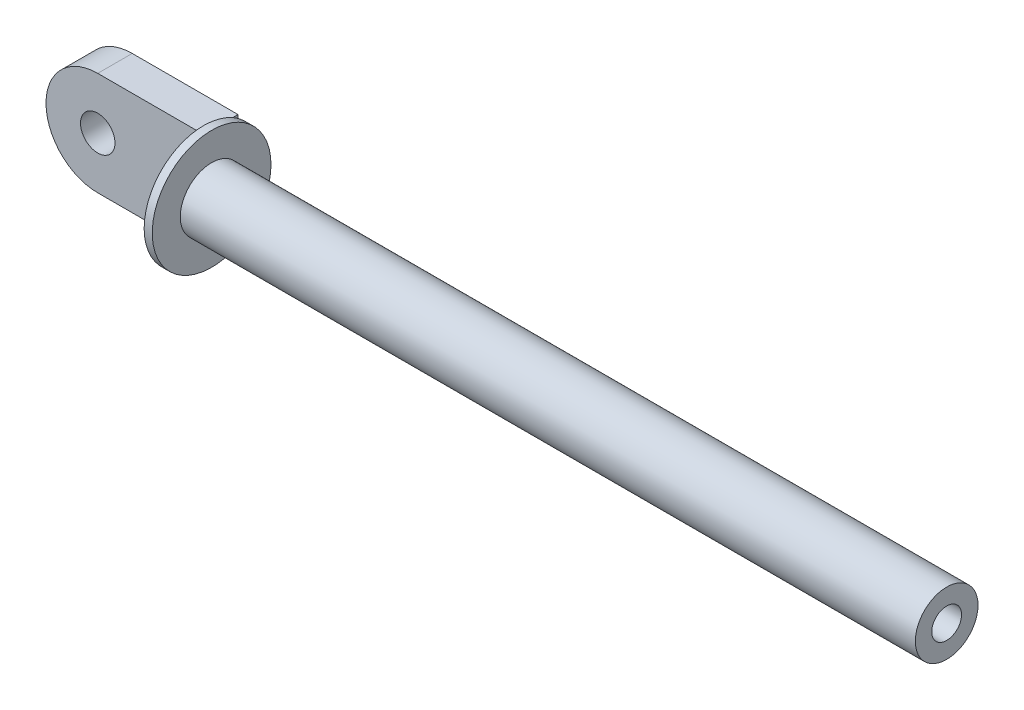
ISO-10303-21;
HEADER;
FILE_DESCRIPTION(('STEP AP214'),'2;1');
FILE_NAME('part.step','',(''),(''),'','','');
FILE_SCHEMA(('AUTOMOTIVE_DESIGN { 1 0 10303 214 1 1 1 1 }'));
ENDSEC;
DATA;
#1=APPLICATION_CONTEXT('core data for automotive mechanical design processes');
#2=APPLICATION_PROTOCOL_DEFINITION('international standard','automotive_design',2000,#1);
#3=PRODUCT_CONTEXT('',#1,'mechanical');
#4=PRODUCT('Part','Part','',(#3));
#5=PRODUCT_RELATED_PRODUCT_CATEGORY('part','',(#4));
#6=PRODUCT_DEFINITION_FORMATION('','',#4);
#7=PRODUCT_DEFINITION_CONTEXT('part definition',#1,'design');
#8=PRODUCT_DEFINITION('design','',#6,#7);
#9=PRODUCT_DEFINITION_SHAPE('','',#8);
#10=(LENGTH_UNIT() NAMED_UNIT(*) SI_UNIT(.MILLI.,.METRE.));
#11=(NAMED_UNIT(*) PLANE_ANGLE_UNIT() SI_UNIT($,.RADIAN.));
#12=(NAMED_UNIT(*) SI_UNIT($,.STERADIAN.) SOLID_ANGLE_UNIT());
#13=UNCERTAINTY_MEASURE_WITH_UNIT(LENGTH_MEASURE(1.E-05),#10,'distance_accuracy_value','');
#14=(GEOMETRIC_REPRESENTATION_CONTEXT(3) GLOBAL_UNCERTAINTY_ASSIGNED_CONTEXT((#13)) GLOBAL_UNIT_ASSIGNED_CONTEXT((#10,
#11,#12)) REPRESENTATION_CONTEXT('',''));
#15=CARTESIAN_POINT('',(0.,0.,0.));
#16=DIRECTION('',(0.,0.,1.));
#17=DIRECTION('',(1.,0.,0.));
#18=AXIS2_PLACEMENT_3D('',#15,#16,#17);
#19=CARTESIAN_POINT('',(-53.0741906660765,45.7845146012682,5.));
#20=DIRECTION('',(-1.,0.,0.));
#21=DIRECTION('',(0.,-1.,0.));
#22=AXIS2_PLACEMENT_3D('',#19,#20,#21);
#23=PLANE('',#22);
#24=CARTESIAN_POINT('',(-53.0741906660765,30.7845146012682,5.));
#25=DIRECTION('',(1.,0.,0.));
#26=DIRECTION('',(0.,0.,-1.));
#27=AXIS2_PLACEMENT_3D('',#24,#25,#26);
#28=CIRCLE('',#27,17.213274528243);
#29=CARTESIAN_POINT('',(-53.0741906660765,44.7951113046445,-5.));
#30=VERTEX_POINT('',#29);
#31=CARTESIAN_POINT('',(-53.0741906660765,45.7845146012682,-3.44374442914163));
#32=VERTEX_POINT('',#31);
#33=EDGE_CURVE('E43',#30,#32,#28,.T.);
#34=ORIENTED_EDGE('',*,*,#33,.F.);
#35=DIRECTION('',(0.,1.,0.));
#36=VECTOR('',#35,1.);
#37=CARTESIAN_POINT('',(-53.0741906660765,45.7845146012682,-5.));
#38=LINE('',#37,#36);
#39=CARTESIAN_POINT('',(-53.0741906660765,45.7845146012682,-5.));
#40=VERTEX_POINT('',#39);
#41=EDGE_CURVE('E94',#30,#40,#38,.T.);
#42=ORIENTED_EDGE('',*,*,#41,.T.);
#43=DIRECTION('',(0.,0.,-1.));
#44=VECTOR('',#43,1.);
#45=CARTESIAN_POINT('',(-53.0741906660765,45.7845146012682,5.));
#46=LINE('',#45,#44);
#47=EDGE_CURVE('E57',#32,#40,#46,.T.);
#48=ORIENTED_EDGE('',*,*,#47,.F.);
#49=EDGE_LOOP('',(#34,#42,#48));
#50=FACE_BOUND('',#49,.T.);
#51=ADVANCED_FACE('F33',(#50),#23,.F.);
#52=CARTESIAN_POINT('',(-83.7380103607654,30.7845146012682,5.));
#53=DIRECTION('',(0.,0.,1.));
#54=DIRECTION('',(1.,0.,0.));
#55=AXIS2_PLACEMENT_3D('',#52,#53,#54);
#56=PLANE('',#55);
#57=CARTESIAN_POINT('',(-83.7380103607654,30.7845146012682,5.));
#58=DIRECTION('',(0.,0.,1.));
#59=DIRECTION('',(1.,0.,0.));
#60=AXIS2_PLACEMENT_3D('',#57,#58,#59);
#61=CIRCLE('',#60,15.);
#62=CARTESIAN_POINT('',(-83.7380103607654,45.7845146012682,5.));
#63=VERTEX_POINT('',#62);
#64=CARTESIAN_POINT('',(-83.7380103607654,15.7845146012682,5.));
#65=VERTEX_POINT('',#64);
#66=EDGE_CURVE('E126',#63,#65,#61,.T.);
#67=ORIENTED_EDGE('',*,*,#66,.T.);
#68=DIRECTION('',(1.,0.,0.));
#69=VECTOR('',#68,1.);
#70=CARTESIAN_POINT('',(-83.7380103607654,15.7845146012682,5.));
#71=LINE('',#70,#69);
#72=CARTESIAN_POINT('',(-53.0741906660765,15.7845146012682,5.));
#73=VERTEX_POINT('',#72);
#74=EDGE_CURVE('E129',#65,#73,#71,.T.);
#75=ORIENTED_EDGE('',*,*,#74,.T.);
#76=DIRECTION('',(0.,1.,0.));
#77=VECTOR('',#76,1.);
#78=CARTESIAN_POINT('',(-53.0741906660765,45.7845146012682,5.));
#79=LINE('',#78,#77);
#80=CARTESIAN_POINT('',(-53.0741906660765,45.7845146012682,5.));
#81=VERTEX_POINT('',#80);
#82=EDGE_CURVE('E131',#73,#81,#79,.T.);
#83=ORIENTED_EDGE('',*,*,#82,.T.);
#84=DIRECTION('',(-1.,0.,0.));
#85=VECTOR('',#84,1.);
#86=CARTESIAN_POINT('',(-83.7380103607654,45.7845146012682,5.));
#87=LINE('',#86,#85);
#88=EDGE_CURVE('E133',#81,#63,#87,.T.);
#89=ORIENTED_EDGE('',*,*,#88,.T.);
#90=EDGE_LOOP('',(#67,#75,#83,#89));
#91=FACE_BOUND('',#90,.T.);
#92=CARTESIAN_POINT('',(-83.7380103607654,30.7845146012682,5.));
#93=DIRECTION('',(0.,0.,1.));
#94=DIRECTION('',(1.,0.,0.));
#95=AXIS2_PLACEMENT_3D('',#92,#93,#94);
#96=CIRCLE('',#95,5.00000000000001);
#97=CARTESIAN_POINT('',(-78.7380103607654,30.7845146012682,5.));
#98=VERTEX_POINT('',#97);
#99=EDGE_CURVE('E120',#98,#98,#96,.T.);
#100=ORIENTED_EDGE('',*,*,#99,.F.);
#101=EDGE_LOOP('',(#100));
#102=FACE_BOUND('',#101,.T.);
#103=ADVANCED_FACE('F158',(#91,#102),#56,.T.);
#104=CARTESIAN_POINT('',(-83.7380103607654,30.7845146012682,-5.));
#105=DIRECTION('',(0.,0.,1.));
#106=DIRECTION('',(1.,0.,0.));
#107=AXIS2_PLACEMENT_3D('',#104,#105,#106);
#108=PLANE('',#107);
#109=CARTESIAN_POINT('',(-83.7380103607654,30.7845146012682,-5.));
#110=DIRECTION('',(0.,0.,1.));
#111=DIRECTION('',(1.,0.,0.));
#112=AXIS2_PLACEMENT_3D('',#109,#110,#111);
#113=CIRCLE('',#112,15.);
#114=CARTESIAN_POINT('',(-83.7380103607654,45.7845146012682,-5.));
#115=VERTEX_POINT('',#114);
#116=CARTESIAN_POINT('',(-83.7380103607654,15.7845146012682,-5.));
#117=VERTEX_POINT('',#116);
#118=EDGE_CURVE('E123',#115,#117,#113,.T.);
#119=ORIENTED_EDGE('',*,*,#118,.F.);
#120=DIRECTION('',(-1.,0.,0.));
#121=VECTOR('',#120,1.);
#122=CARTESIAN_POINT('',(-83.7380103607654,45.7845146012682,-5.));
#123=LINE('',#122,#121);
#124=EDGE_CURVE('E91',#40,#115,#123,.T.);
#125=ORIENTED_EDGE('',*,*,#124,.F.);
#126=ORIENTED_EDGE('',*,*,#41,.F.);
#127=CARTESIAN_POINT('',(-53.0741906660765,16.7739178978918,-5.));
#128=VERTEX_POINT('',#127);
#129=EDGE_CURVE('E92',#128,#30,#38,.T.);
#130=ORIENTED_EDGE('',*,*,#129,.F.);
#131=CARTESIAN_POINT('',(-53.0741906660765,15.7845146012682,-5.));
#132=VERTEX_POINT('',#131);
#133=EDGE_CURVE('E85',#132,#128,#38,.T.);
#134=ORIENTED_EDGE('',*,*,#133,.F.);
#135=DIRECTION('',(1.,0.,0.));
#136=VECTOR('',#135,1.);
#137=CARTESIAN_POINT('',(-83.7380103607654,15.7845146012682,-5.));
#138=LINE('',#137,#136);
#139=EDGE_CURVE('E138',#117,#132,#138,.T.);
#140=ORIENTED_EDGE('',*,*,#139,.F.);
#141=EDGE_LOOP('',(#119,#125,#126,#130,#134,#140));
#142=FACE_BOUND('',#141,.T.);
#143=CARTESIAN_POINT('',(-83.7380103607654,30.7845146012682,-5.));
#144=DIRECTION('',(0.,0.,1.));
#145=DIRECTION('',(1.,0.,0.));
#146=AXIS2_PLACEMENT_3D('',#143,#144,#145);
#147=CIRCLE('',#146,5.00000000000001);
#148=CARTESIAN_POINT('',(-78.7380103607654,30.7845146012682,-5.));
#149=VERTEX_POINT('',#148);
#150=EDGE_CURVE('E116',#149,#149,#147,.T.);
#151=ORIENTED_EDGE('',*,*,#150,.T.);
#152=EDGE_LOOP('',(#151));
#153=FACE_BOUND('',#152,.T.);
#154=ADVANCED_FACE('F99',(#142,#153),#108,.F.);
#155=CARTESIAN_POINT('',(-83.7380103607654,30.7845146012682,5.));
#156=DIRECTION('',(0.,0.,-1.));
#157=DIRECTION('',(-1.,0.,0.));
#158=AXIS2_PLACEMENT_3D('',#155,#156,#157);
#159=CYLINDRICAL_SURFACE('',#158,15.);
#160=ORIENTED_EDGE('',*,*,#118,.T.);
#161=DIRECTION('',(0.,0.,-1.));
#162=VECTOR('',#161,1.);
#163=CARTESIAN_POINT('',(-83.7380103607654,15.7845146012682,5.));
#164=LINE('',#163,#162);
#165=EDGE_CURVE('E37',#65,#117,#164,.T.);
#166=ORIENTED_EDGE('',*,*,#165,.F.);
#167=ORIENTED_EDGE('',*,*,#66,.F.);
#168=DIRECTION('',(0.,0.,-1.));
#169=VECTOR('',#168,1.);
#170=CARTESIAN_POINT('',(-83.7380103607654,45.7845146012682,5.));
#171=LINE('',#170,#169);
#172=EDGE_CURVE('E135',#63,#115,#171,.T.);
#173=ORIENTED_EDGE('',*,*,#172,.T.);
#174=EDGE_LOOP('',(#160,#166,#167,#173));
#175=FACE_BOUND('',#174,.T.);
#176=ADVANCED_FACE('F35',(#175),#159,.T.);
#177=CARTESIAN_POINT('',(-83.7380103607654,15.7845146012682,5.));
#178=DIRECTION('',(0.,1.,0.));
#179=DIRECTION('',(0.,0.,1.));
#180=AXIS2_PLACEMENT_3D('',#177,#178,#179);
#181=PLANE('',#180);
#182=ORIENTED_EDGE('',*,*,#139,.T.);
#183=DIRECTION('',(0.,0.,-1.));
#184=VECTOR('',#183,1.);
#185=CARTESIAN_POINT('',(-53.0741906660765,15.7845146012682,5.));
#186=LINE('',#185,#184);
#187=CARTESIAN_POINT('',(-53.0741906660765,15.7845146012682,-3.44374442914163));
#188=VERTEX_POINT('',#187);
#189=EDGE_CURVE('E88',#188,#132,#186,.T.);
#190=ORIENTED_EDGE('',*,*,#189,.F.);
#191=EDGE_CURVE('E144',#73,#188,#186,.T.);
#192=ORIENTED_EDGE('',*,*,#191,.F.);
#193=ORIENTED_EDGE('',*,*,#74,.F.);
#194=ORIENTED_EDGE('',*,*,#165,.T.);
#195=EDGE_LOOP('',(#182,#190,#192,#193,#194));
#196=FACE_BOUND('',#195,.T.);
#197=ADVANCED_FACE('F150',(#196),#181,.F.);
#198=EDGE_CURVE('E11',#188,#128,#28,.T.);
#199=ORIENTED_EDGE('',*,*,#198,.F.);
#200=ORIENTED_EDGE('',*,*,#189,.T.);
#201=ORIENTED_EDGE('',*,*,#133,.T.);
#202=EDGE_LOOP('',(#199,#200,#201));
#203=FACE_BOUND('',#202,.T.);
#204=ADVANCED_FACE('F87',(#203),#23,.F.);
#205=CARTESIAN_POINT('',(-83.7380103607654,45.7845146012682,5.));
#206=DIRECTION('',(0.,-1.,0.));
#207=DIRECTION('',(0.,0.,-1.));
#208=AXIS2_PLACEMENT_3D('',#205,#206,#207);
#209=PLANE('',#208);
#210=ORIENTED_EDGE('',*,*,#124,.T.);
#211=ORIENTED_EDGE('',*,*,#172,.F.);
#212=ORIENTED_EDGE('',*,*,#88,.F.);
#213=EDGE_CURVE('E143',#81,#32,#46,.T.);
#214=ORIENTED_EDGE('',*,*,#213,.T.);
#215=ORIENTED_EDGE('',*,*,#47,.T.);
#216=EDGE_LOOP('',(#210,#211,#212,#214,#215));
#217=FACE_BOUND('',#216,.T.);
#218=ADVANCED_FACE('F155',(#217),#209,.F.);
#219=CARTESIAN_POINT('',(-83.7380103607654,30.7845146012682,5.));
#220=DIRECTION('',(0.,0.,-1.));
#221=DIRECTION('',(-1.,0.,0.));
#222=AXIS2_PLACEMENT_3D('',#219,#220,#221);
#223=CYLINDRICAL_SURFACE('',#222,5.00000000000001);
#224=ORIENTED_EDGE('',*,*,#99,.T.);
#225=EDGE_LOOP('',(#224));
#226=FACE_BOUND('',#225,.T.);
#227=ORIENTED_EDGE('',*,*,#150,.F.);
#228=EDGE_LOOP('',(#227));
#229=FACE_BOUND('',#228,.T.);
#230=ADVANCED_FACE('F171',(#226,#229),#223,.F.);
#231=CARTESIAN_POINT('',(-53.0741906660765,45.7845146012682,5.));
#232=DIRECTION('',(-1.,0.,0.));
#233=DIRECTION('',(0.,0.,1.));
#234=AXIS2_PLACEMENT_3D('',#231,#232,#233);
#235=PLANE('',#234);
#236=ORIENTED_EDGE('',*,*,#213,.F.);
#237=ORIENTED_EDGE('',*,*,#82,.F.);
#238=ORIENTED_EDGE('',*,*,#191,.T.);
#239=EDGE_CURVE('E44',#32,#188,#28,.T.);
#240=ORIENTED_EDGE('',*,*,#239,.F.);
#241=EDGE_LOOP('',(#236,#237,#238,#240));
#242=FACE_BOUND('',#241,.T.);
#243=ADVANCED_FACE('F184',(#242),#235,.T.);
#244=EDGE_CURVE('E104',#128,#30,#28,.T.);
#245=ORIENTED_EDGE('',*,*,#244,.F.);
#246=ORIENTED_EDGE('',*,*,#129,.T.);
#247=EDGE_LOOP('',(#245,#246));
#248=FACE_BOUND('',#247,.T.);
#249=ADVANCED_FACE('F105',(#248),#235,.T.);
#250=CARTESIAN_POINT('',(-48.6587638983746,30.7845146012682,5.));
#251=DIRECTION('',(1.,0.,0.));
#252=DIRECTION('',(0.,0.,-1.));
#253=AXIS2_PLACEMENT_3D('',#250,#251,#252);
#254=CYLINDRICAL_SURFACE('',#253,17.213274528243);
#255=ORIENTED_EDGE('',*,*,#33,.T.);
#256=ORIENTED_EDGE('',*,*,#239,.T.);
#257=ORIENTED_EDGE('',*,*,#198,.T.);
#258=ORIENTED_EDGE('',*,*,#244,.T.);
#259=EDGE_LOOP('',(#255,#256,#257,#258));
#260=FACE_BOUND('',#259,.T.);
#261=CARTESIAN_POINT('',(-50.7284292030232,30.7845146012682,5.));
#262=DIRECTION('',(1.,0.,0.));
#263=DIRECTION('',(0.,0.,-1.));
#264=AXIS2_PLACEMENT_3D('',#261,#262,#263);
#265=CIRCLE('',#264,17.213274528243);
#266=CARTESIAN_POINT('',(-50.7284292030232,30.7845146012682,-12.213274528243));
#267=VERTEX_POINT('',#266);
#268=EDGE_CURVE('E108',#267,#267,#265,.T.);
#269=ORIENTED_EDGE('',*,*,#268,.F.);
#270=EDGE_LOOP('',(#269));
#271=FACE_BOUND('',#270,.T.);
#272=ADVANCED_FACE('F110',(#260,#271),#254,.T.);
#273=CARTESIAN_POINT('',(-50.7284292030232,47.9977891295112,5.));
#274=DIRECTION('',(1.,0.,0.));
#275=DIRECTION('',(0.,0.,-1.));
#276=AXIS2_PLACEMENT_3D('',#273,#274,#275);
#277=PLANE('',#276);
#278=ORIENTED_EDGE('',*,*,#268,.T.);
#279=EDGE_LOOP('',(#278));
#280=FACE_BOUND('',#279,.T.);
#281=CARTESIAN_POINT('',(-50.7284292030232,30.7845146012682,5.));
#282=DIRECTION('',(1.,0.,0.));
#283=DIRECTION('',(0.,0.,-1.));
#284=AXIS2_PLACEMENT_3D('',#281,#282,#283);
#285=CIRCLE('',#284,9.08463649814974);
#286=CARTESIAN_POINT('',(-50.7284292030232,30.7845146012682,-4.08463649814974));
#287=VERTEX_POINT('',#286);
#288=EDGE_CURVE('E222',#287,#287,#285,.T.);
#289=ORIENTED_EDGE('',*,*,#288,.F.);
#290=EDGE_LOOP('',(#289));
#291=FACE_BOUND('',#290,.T.);
#292=ADVANCED_FACE('F190',(#280,#291),#277,.T.);
#293=CARTESIAN_POINT('',(-48.6587638983746,30.7845146012682,5.));
#294=DIRECTION('',(1.,0.,0.));
#295=DIRECTION('',(0.,0.,-1.));
#296=AXIS2_PLACEMENT_3D('',#293,#294,#295);
#297=CYLINDRICAL_SURFACE('',#296,9.08463649814974);
#298=ORIENTED_EDGE('',*,*,#288,.T.);
#299=EDGE_LOOP('',(#298));
#300=FACE_BOUND('',#299,.T.);
#301=CARTESIAN_POINT('',(162.360473407795,30.7845146012682,5.));
#302=DIRECTION('',(1.,0.,0.));
#303=DIRECTION('',(0.,0.,-1.));
#304=AXIS2_PLACEMENT_3D('',#301,#302,#303);
#305=CIRCLE('',#304,9.08463649814974);
#306=CARTESIAN_POINT('',(162.360473407795,30.7845146012682,-4.08463649814974));
#307=VERTEX_POINT('',#306);
#308=EDGE_CURVE('E218',#307,#307,#305,.T.);
#309=ORIENTED_EDGE('',*,*,#308,.F.);
#310=EDGE_LOOP('',(#309));
#311=FACE_BOUND('',#310,.T.);
#312=ADVANCED_FACE('F193',(#300,#311),#297,.T.);
#313=CARTESIAN_POINT('',(162.360473407795,39.8691510994179,5.));
#314=DIRECTION('',(1.,0.,0.));
#315=DIRECTION('',(0.,0.,-1.));
#316=AXIS2_PLACEMENT_3D('',#313,#314,#315);
#317=PLANE('',#316);
#318=ORIENTED_EDGE('',*,*,#308,.T.);
#319=EDGE_LOOP('',(#318));
#320=FACE_BOUND('',#319,.T.);
#321=CARTESIAN_POINT('',(162.360473407795,30.7845146012682,5.));
#322=DIRECTION('',(1.,0.,0.));
#323=DIRECTION('',(0.,0.,-1.));
#324=AXIS2_PLACEMENT_3D('',#321,#322,#323);
#325=CIRCLE('',#324,4.32297474650224);
#326=CARTESIAN_POINT('',(162.360473407795,30.7845146012682,0.677025253497758));
#327=VERTEX_POINT('',#326);
#328=EDGE_CURVE('E215',#327,#327,#325,.T.);
#329=ORIENTED_EDGE('',*,*,#328,.F.);
#330=EDGE_LOOP('',(#329));
#331=FACE_BOUND('',#330,.T.);
#332=ADVANCED_FACE('F197',(#320,#331),#317,.T.);
#333=CARTESIAN_POINT('',(-48.6587638983746,30.7845146012682,5.));
#334=DIRECTION('',(1.,0.,0.));
#335=DIRECTION('',(0.,0.,-1.));
#336=AXIS2_PLACEMENT_3D('',#333,#334,#335);
#337=CYLINDRICAL_SURFACE('',#336,4.32297474650223);
#338=ORIENTED_EDGE('',*,*,#328,.T.);
#339=EDGE_LOOP('',(#338));
#340=FACE_BOUND('',#339,.T.);
#341=CARTESIAN_POINT('',(-48.6587638983746,30.7845146012682,5.));
#342=DIRECTION('',(1.,0.,0.));
#343=DIRECTION('',(0.,0.,-1.));
#344=AXIS2_PLACEMENT_3D('',#341,#342,#343);
#345=CIRCLE('',#344,4.32297474650221);
#346=CARTESIAN_POINT('',(-48.6587638983746,30.7845146012682,0.677025253497786));
#347=VERTEX_POINT('',#346);
#348=EDGE_CURVE('E213',#347,#347,#345,.T.);
#349=ORIENTED_EDGE('',*,*,#348,.F.);
#350=EDGE_LOOP('',(#349));
#351=FACE_BOUND('',#350,.T.);
#352=ADVANCED_FACE('F201',(#340,#351),#337,.F.);
#353=CARTESIAN_POINT('',(-48.6587638983746,35.1074893477704,5.));
#354=DIRECTION('',(1.,0.,0.));
#355=DIRECTION('',(0.,0.,-1.));
#356=AXIS2_PLACEMENT_3D('',#353,#354,#355);
#357=PLANE('',#356);
#358=ORIENTED_EDGE('',*,*,#348,.T.);
#359=EDGE_LOOP('',(#358));
#360=FACE_BOUND('',#359,.T.);
#361=ADVANCED_FACE('F205',(#360),#357,.T.);
#362=CLOSED_SHELL('',(#51,#103,#154,#176,#197,#204,#218,#230,#243,#249,#272,#292,#312,#332,#352,#361));
#363=MANIFOLD_SOLID_BREP('B2',#362);
#364=ADVANCED_BREP_SHAPE_REPRESENTATION('',(#18,#363),#14);
#365=SHAPE_DEFINITION_REPRESENTATION(#9,#364);
ENDSEC;
END-ISO-10303-21;
